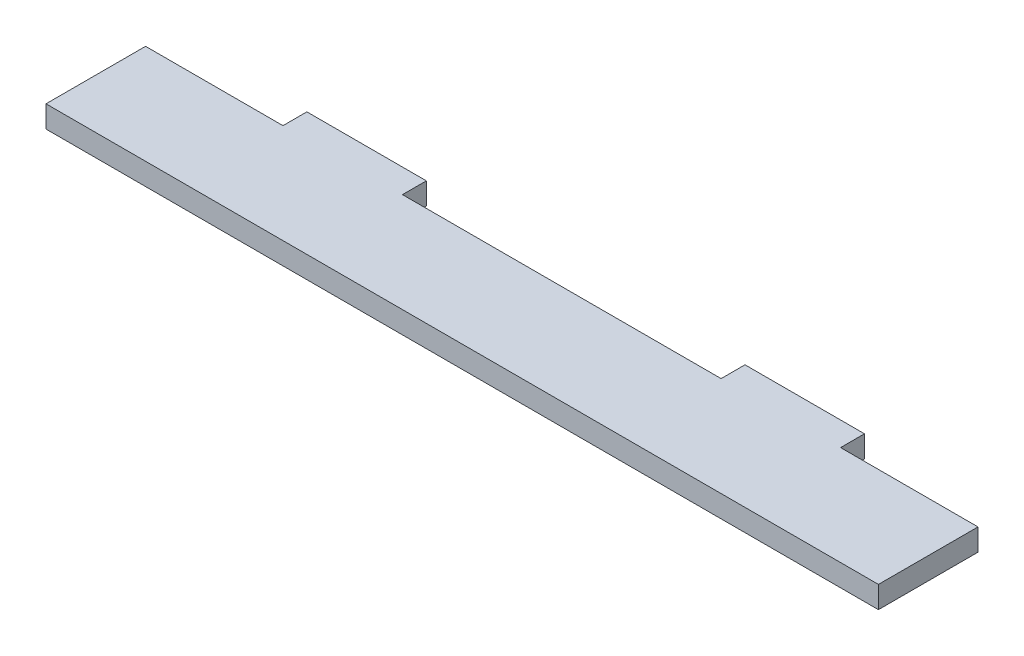
ISO-10303-21;
HEADER;
FILE_DESCRIPTION(('STEP AP214'),'2;1');
FILE_NAME('part.step','',(''),(''),'','','');
FILE_SCHEMA(('AUTOMOTIVE_DESIGN { 1 0 10303 214 1 1 1 1 }'));
ENDSEC;
DATA;
#1=APPLICATION_CONTEXT('core data for automotive mechanical design processes');
#2=APPLICATION_PROTOCOL_DEFINITION('international standard','automotive_design',2000,#1);
#3=PRODUCT_CONTEXT('',#1,'mechanical');
#4=PRODUCT('Part','Part','',(#3));
#5=PRODUCT_RELATED_PRODUCT_CATEGORY('part','',(#4));
#6=PRODUCT_DEFINITION_FORMATION('','',#4);
#7=PRODUCT_DEFINITION_CONTEXT('part definition',#1,'design');
#8=PRODUCT_DEFINITION('design','',#6,#7);
#9=PRODUCT_DEFINITION_SHAPE('','',#8);
#10=(LENGTH_UNIT() NAMED_UNIT(*) SI_UNIT(.MILLI.,.METRE.));
#11=(NAMED_UNIT(*) PLANE_ANGLE_UNIT() SI_UNIT($,.RADIAN.));
#12=(NAMED_UNIT(*) SI_UNIT($,.STERADIAN.) SOLID_ANGLE_UNIT());
#13=UNCERTAINTY_MEASURE_WITH_UNIT(LENGTH_MEASURE(1.E-05),#10,'distance_accuracy_value','');
#14=(GEOMETRIC_REPRESENTATION_CONTEXT(3) GLOBAL_UNCERTAINTY_ASSIGNED_CONTEXT((#13)) GLOBAL_UNIT_ASSIGNED_CONTEXT((#10,
#11,#12)) REPRESENTATION_CONTEXT('',''));
#15=CARTESIAN_POINT('',(0.,0.,0.));
#16=DIRECTION('',(0.,0.,1.));
#17=DIRECTION('',(1.,0.,0.));
#18=AXIS2_PLACEMENT_3D('',#15,#16,#17);
#19=CARTESIAN_POINT('',(-70.,5.5,0.));
#20=DIRECTION('',(-1.,0.,0.));
#21=DIRECTION('',(0.,0.,1.));
#22=AXIS2_PLACEMENT_3D('',#19,#20,#21);
#23=PLANE('',#22);
#24=DIRECTION('',(0.,0.,-1.));
#25=VECTOR('',#24,1.);
#26=CARTESIAN_POINT('',(-70.,0.,0.));
#27=LINE('',#26,#25);
#28=CARTESIAN_POINT('',(-70.,0.,-12.5));
#29=VERTEX_POINT('',#28);
#30=CARTESIAN_POINT('',(-70.,0.,-18.5));
#31=VERTEX_POINT('',#30);
#32=EDGE_CURVE('E202',#29,#31,#27,.T.);
#33=ORIENTED_EDGE('',*,*,#32,.F.);
#34=DIRECTION('',(0.,-1.,0.));
#35=VECTOR('',#34,1.);
#36=CARTESIAN_POINT('',(-70.,5.5,-12.5));
#37=LINE('',#36,#35);
#38=CARTESIAN_POINT('',(-70.,5.5,-12.5));
#39=VERTEX_POINT('',#38);
#40=EDGE_CURVE('E11',#39,#29,#37,.T.);
#41=ORIENTED_EDGE('',*,*,#40,.F.);
#42=DIRECTION('',(0.,0.,-1.));
#43=VECTOR('',#42,1.);
#44=CARTESIAN_POINT('',(-70.,5.5,0.));
#45=LINE('',#44,#43);
#46=CARTESIAN_POINT('',(-70.,5.5,-18.5));
#47=VERTEX_POINT('',#46);
#48=EDGE_CURVE('E163',#39,#47,#45,.T.);
#49=ORIENTED_EDGE('',*,*,#48,.T.);
#50=DIRECTION('',(0.,-1.,0.));
#51=VECTOR('',#50,1.);
#52=CARTESIAN_POINT('',(-70.,5.5,-18.5));
#53=LINE('',#52,#51);
#54=EDGE_CURVE('E55',#47,#31,#53,.T.);
#55=ORIENTED_EDGE('',*,*,#54,.T.);
#56=EDGE_LOOP('',(#33,#41,#49,#55));
#57=FACE_BOUND('',#56,.T.);
#58=ADVANCED_FACE('F39',(#57),#23,.T.);
#59=CARTESIAN_POINT('',(0.,5.5,-12.5));
#60=DIRECTION('',(0.,0.,-1.));
#61=DIRECTION('',(-1.,0.,0.));
#62=AXIS2_PLACEMENT_3D('',#59,#60,#61);
#63=PLANE('',#62);
#64=DIRECTION('',(1.,0.,0.));
#65=VECTOR('',#64,1.);
#66=CARTESIAN_POINT('',(0.,0.,-12.5));
#67=LINE('',#66,#65);
#68=CARTESIAN_POINT('',(-104.5,0.,-12.5));
#69=VERTEX_POINT('',#68);
#70=EDGE_CURVE('E200',#69,#29,#67,.T.);
#71=ORIENTED_EDGE('',*,*,#70,.F.);
#72=DIRECTION('',(0.,-1.,0.));
#73=VECTOR('',#72,1.);
#74=CARTESIAN_POINT('',(-104.5,5.5,-12.5));
#75=LINE('',#74,#73);
#76=CARTESIAN_POINT('',(-104.5,5.5,-12.5));
#77=VERTEX_POINT('',#76);
#78=EDGE_CURVE('E47',#77,#69,#75,.T.);
#79=ORIENTED_EDGE('',*,*,#78,.F.);
#80=DIRECTION('',(1.,0.,0.));
#81=VECTOR('',#80,1.);
#82=CARTESIAN_POINT('',(0.,5.5,-12.5));
#83=LINE('',#82,#81);
#84=EDGE_CURVE('E153',#77,#39,#83,.T.);
#85=ORIENTED_EDGE('',*,*,#84,.T.);
#86=ORIENTED_EDGE('',*,*,#40,.T.);
#87=EDGE_LOOP('',(#71,#79,#85,#86));
#88=FACE_BOUND('',#87,.T.);
#89=ADVANCED_FACE('F201',(#88),#63,.T.);
#90=CARTESIAN_POINT('',(-104.5,5.5,0.));
#91=DIRECTION('',(-1.,0.,0.));
#92=DIRECTION('',(0.,0.,1.));
#93=AXIS2_PLACEMENT_3D('',#90,#91,#92);
#94=PLANE('',#93);
#95=DIRECTION('',(0.,0.,-1.));
#96=VECTOR('',#95,1.);
#97=CARTESIAN_POINT('',(-104.5,0.,0.));
#98=LINE('',#97,#96);
#99=CARTESIAN_POINT('',(-104.5,0.,12.5));
#100=VERTEX_POINT('',#99);
#101=EDGE_CURVE('E197',#100,#69,#98,.T.);
#102=ORIENTED_EDGE('',*,*,#101,.F.);
#103=DIRECTION('',(0.,-1.,0.));
#104=VECTOR('',#103,1.);
#105=CARTESIAN_POINT('',(-104.5,5.5,12.5));
#106=LINE('',#105,#104);
#107=CARTESIAN_POINT('',(-104.5,5.5,12.5));
#108=VERTEX_POINT('',#107);
#109=EDGE_CURVE('E191',#108,#100,#106,.T.);
#110=ORIENTED_EDGE('',*,*,#109,.F.);
#111=DIRECTION('',(0.,0.,-1.));
#112=VECTOR('',#111,1.);
#113=CARTESIAN_POINT('',(-104.5,5.5,0.));
#114=LINE('',#113,#112);
#115=EDGE_CURVE('E162',#108,#77,#114,.T.);
#116=ORIENTED_EDGE('',*,*,#115,.T.);
#117=ORIENTED_EDGE('',*,*,#78,.T.);
#118=EDGE_LOOP('',(#102,#110,#116,#117));
#119=FACE_BOUND('',#118,.T.);
#120=ADVANCED_FACE('F195',(#119),#94,.T.);
#121=CARTESIAN_POINT('',(0.,5.5,12.5));
#122=DIRECTION('',(0.,0.,-1.));
#123=DIRECTION('',(-1.,0.,0.));
#124=AXIS2_PLACEMENT_3D('',#121,#122,#123);
#125=PLANE('',#124);
#126=DIRECTION('',(1.,0.,0.));
#127=VECTOR('',#126,1.);
#128=CARTESIAN_POINT('',(0.,0.,12.5));
#129=LINE('',#128,#127);
#130=CARTESIAN_POINT('',(104.5,0.,12.5));
#131=VERTEX_POINT('',#130);
#132=EDGE_CURVE('E208',#100,#131,#129,.T.);
#133=ORIENTED_EDGE('',*,*,#132,.T.);
#134=DIRECTION('',(0.,-1.,0.));
#135=VECTOR('',#134,1.);
#136=CARTESIAN_POINT('',(104.5,5.5,12.5));
#137=LINE('',#136,#135);
#138=CARTESIAN_POINT('',(104.5,5.5,12.5));
#139=VERTEX_POINT('',#138);
#140=EDGE_CURVE('E188',#139,#131,#137,.T.);
#141=ORIENTED_EDGE('',*,*,#140,.F.);
#142=DIRECTION('',(1.,0.,0.));
#143=VECTOR('',#142,1.);
#144=CARTESIAN_POINT('',(0.,5.5,12.5));
#145=LINE('',#144,#143);
#146=EDGE_CURVE('E167',#108,#139,#145,.T.);
#147=ORIENTED_EDGE('',*,*,#146,.F.);
#148=ORIENTED_EDGE('',*,*,#109,.T.);
#149=EDGE_LOOP('',(#133,#141,#147,#148));
#150=FACE_BOUND('',#149,.T.);
#151=ADVANCED_FACE('F238',(#150),#125,.F.);
#152=CARTESIAN_POINT('',(104.5,5.5,0.));
#153=DIRECTION('',(-1.,0.,0.));
#154=DIRECTION('',(0.,0.,1.));
#155=AXIS2_PLACEMENT_3D('',#152,#153,#154);
#156=PLANE('',#155);
#157=DIRECTION('',(0.,0.,-1.));
#158=VECTOR('',#157,1.);
#159=CARTESIAN_POINT('',(104.5,0.,0.));
#160=LINE('',#159,#158);
#161=CARTESIAN_POINT('',(104.5,0.,-12.5));
#162=VERTEX_POINT('',#161);
#163=EDGE_CURVE('E210',#131,#162,#160,.T.);
#164=ORIENTED_EDGE('',*,*,#163,.T.);
#165=DIRECTION('',(0.,-1.,0.));
#166=VECTOR('',#165,1.);
#167=CARTESIAN_POINT('',(104.5,5.5,-12.5));
#168=LINE('',#167,#166);
#169=CARTESIAN_POINT('',(104.5,5.5,-12.5));
#170=VERTEX_POINT('',#169);
#171=EDGE_CURVE('E186',#170,#162,#168,.T.);
#172=ORIENTED_EDGE('',*,*,#171,.F.);
#173=DIRECTION('',(0.,0.,-1.));
#174=VECTOR('',#173,1.);
#175=CARTESIAN_POINT('',(104.5,5.5,0.));
#176=LINE('',#175,#174);
#177=EDGE_CURVE('E160',#139,#170,#176,.T.);
#178=ORIENTED_EDGE('',*,*,#177,.F.);
#179=ORIENTED_EDGE('',*,*,#140,.T.);
#180=EDGE_LOOP('',(#164,#172,#178,#179));
#181=FACE_BOUND('',#180,.T.);
#182=ADVANCED_FACE('F234',(#181),#156,.F.);
#183=CARTESIAN_POINT('',(70.,0.,-12.5));
#184=VERTEX_POINT('',#183);
#185=EDGE_CURVE('E204',#184,#162,#67,.T.);
#186=ORIENTED_EDGE('',*,*,#185,.F.);
#187=DIRECTION('',(0.,-1.,0.));
#188=VECTOR('',#187,1.);
#189=CARTESIAN_POINT('',(70.,5.5,-12.5));
#190=LINE('',#189,#188);
#191=CARTESIAN_POINT('',(70.,5.5,-12.5));
#192=VERTEX_POINT('',#191);
#193=EDGE_CURVE('E184',#192,#184,#190,.T.);
#194=ORIENTED_EDGE('',*,*,#193,.F.);
#195=EDGE_CURVE('E152',#192,#170,#83,.T.);
#196=ORIENTED_EDGE('',*,*,#195,.T.);
#197=ORIENTED_EDGE('',*,*,#171,.T.);
#198=EDGE_LOOP('',(#186,#194,#196,#197));
#199=FACE_BOUND('',#198,.T.);
#200=ADVANCED_FACE('F228',(#199),#63,.T.);
#201=CARTESIAN_POINT('',(70.,5.5,0.));
#202=DIRECTION('',(-1.,0.,0.));
#203=DIRECTION('',(0.,0.,1.));
#204=AXIS2_PLACEMENT_3D('',#201,#202,#203);
#205=PLANE('',#204);
#206=DIRECTION('',(0.,0.,-1.));
#207=VECTOR('',#206,1.);
#208=CARTESIAN_POINT('',(70.,0.,0.));
#209=LINE('',#208,#207);
#210=CARTESIAN_POINT('',(70.,0.,-18.5));
#211=VERTEX_POINT('',#210);
#212=EDGE_CURVE('E216',#184,#211,#209,.T.);
#213=ORIENTED_EDGE('',*,*,#212,.T.);
#214=DIRECTION('',(0.,-1.,0.));
#215=VECTOR('',#214,1.);
#216=CARTESIAN_POINT('',(70.,5.5,-18.5));
#217=LINE('',#216,#215);
#218=CARTESIAN_POINT('',(70.,5.5,-18.5));
#219=VERTEX_POINT('',#218);
#220=EDGE_CURVE('E181',#219,#211,#217,.T.);
#221=ORIENTED_EDGE('',*,*,#220,.F.);
#222=DIRECTION('',(0.,0.,-1.));
#223=VECTOR('',#222,1.);
#224=CARTESIAN_POINT('',(70.,5.5,0.));
#225=LINE('',#224,#223);
#226=EDGE_CURVE('E159',#192,#219,#225,.T.);
#227=ORIENTED_EDGE('',*,*,#226,.F.);
#228=ORIENTED_EDGE('',*,*,#193,.T.);
#229=EDGE_LOOP('',(#213,#221,#227,#228));
#230=FACE_BOUND('',#229,.T.);
#231=ADVANCED_FACE('F261',(#230),#205,.F.);
#232=CARTESIAN_POINT('',(0.,5.5,-18.5));
#233=DIRECTION('',(0.,0.,1.));
#234=DIRECTION('',(1.,0.,0.));
#235=AXIS2_PLACEMENT_3D('',#232,#233,#234);
#236=PLANE('',#235);
#237=DIRECTION('',(-1.,0.,0.));
#238=VECTOR('',#237,1.);
#239=CARTESIAN_POINT('',(0.,0.,-18.5));
#240=LINE('',#239,#238);
#241=CARTESIAN_POINT('',(40.,0.,-18.5));
#242=VERTEX_POINT('',#241);
#243=EDGE_CURVE('E218',#211,#242,#240,.T.);
#244=ORIENTED_EDGE('',*,*,#243,.T.);
#245=DIRECTION('',(0.,-1.,0.));
#246=VECTOR('',#245,1.);
#247=CARTESIAN_POINT('',(40.,5.5,-18.5));
#248=LINE('',#247,#246);
#249=CARTESIAN_POINT('',(40.,5.5,-18.5));
#250=VERTEX_POINT('',#249);
#251=EDGE_CURVE('E179',#250,#242,#248,.T.);
#252=ORIENTED_EDGE('',*,*,#251,.F.);
#253=DIRECTION('',(-1.,0.,0.));
#254=VECTOR('',#253,1.);
#255=CARTESIAN_POINT('',(0.,5.5,-18.5));
#256=LINE('',#255,#254);
#257=EDGE_CURVE('E154',#219,#250,#256,.T.);
#258=ORIENTED_EDGE('',*,*,#257,.F.);
#259=ORIENTED_EDGE('',*,*,#220,.T.);
#260=EDGE_LOOP('',(#244,#252,#258,#259));
#261=FACE_BOUND('',#260,.T.);
#262=ADVANCED_FACE('F267',(#261),#236,.F.);
#263=CARTESIAN_POINT('',(40.,5.5,0.));
#264=DIRECTION('',(-1.,0.,0.));
#265=DIRECTION('',(0.,0.,1.));
#266=AXIS2_PLACEMENT_3D('',#263,#264,#265);
#267=PLANE('',#266);
#268=DIRECTION('',(0.,0.,-1.));
#269=VECTOR('',#268,1.);
#270=CARTESIAN_POINT('',(40.,0.,0.));
#271=LINE('',#270,#269);
#272=CARTESIAN_POINT('',(40.,0.,-12.5));
#273=VERTEX_POINT('',#272);
#274=EDGE_CURVE('E220',#273,#242,#271,.T.);
#275=ORIENTED_EDGE('',*,*,#274,.F.);
#276=DIRECTION('',(0.,-1.,0.));
#277=VECTOR('',#276,1.);
#278=CARTESIAN_POINT('',(40.,5.5,-12.5));
#279=LINE('',#278,#277);
#280=CARTESIAN_POINT('',(40.,5.5,-12.5));
#281=VERTEX_POINT('',#280);
#282=EDGE_CURVE('E139',#281,#273,#279,.T.);
#283=ORIENTED_EDGE('',*,*,#282,.F.);
#284=DIRECTION('',(0.,0.,-1.));
#285=VECTOR('',#284,1.);
#286=CARTESIAN_POINT('',(40.,5.5,0.));
#287=LINE('',#286,#285);
#288=EDGE_CURVE('E150',#281,#250,#287,.T.);
#289=ORIENTED_EDGE('',*,*,#288,.T.);
#290=ORIENTED_EDGE('',*,*,#251,.T.);
#291=EDGE_LOOP('',(#275,#283,#289,#290));
#292=FACE_BOUND('',#291,.T.);
#293=ADVANCED_FACE('F263',(#292),#267,.T.);
#294=CARTESIAN_POINT('',(-40.,0.,-12.5));
#295=VERTEX_POINT('',#294);
#296=EDGE_CURVE('E136',#295,#273,#67,.T.);
#297=ORIENTED_EDGE('',*,*,#296,.F.);
#298=DIRECTION('',(0.,-1.,0.));
#299=VECTOR('',#298,1.);
#300=CARTESIAN_POINT('',(-40.,5.5,-12.5));
#301=LINE('',#300,#299);
#302=CARTESIAN_POINT('',(-40.,5.5,-12.5));
#303=VERTEX_POINT('',#302);
#304=EDGE_CURVE('E130',#303,#295,#301,.T.);
#305=ORIENTED_EDGE('',*,*,#304,.F.);
#306=EDGE_CURVE('E134',#303,#281,#83,.T.);
#307=ORIENTED_EDGE('',*,*,#306,.T.);
#308=ORIENTED_EDGE('',*,*,#282,.T.);
#309=EDGE_LOOP('',(#297,#305,#307,#308));
#310=FACE_BOUND('',#309,.T.);
#311=ADVANCED_FACE('F132',(#310),#63,.T.);
#312=CARTESIAN_POINT('',(-40.,5.5,0.));
#313=DIRECTION('',(-1.,0.,0.));
#314=DIRECTION('',(0.,0.,1.));
#315=AXIS2_PLACEMENT_3D('',#312,#313,#314);
#316=PLANE('',#315);
#317=DIRECTION('',(0.,0.,-1.));
#318=VECTOR('',#317,1.);
#319=CARTESIAN_POINT('',(-40.,0.,0.));
#320=LINE('',#319,#318);
#321=CARTESIAN_POINT('',(-40.,0.,-18.5));
#322=VERTEX_POINT('',#321);
#323=EDGE_CURVE('E170',#295,#322,#320,.T.);
#324=ORIENTED_EDGE('',*,*,#323,.T.);
#325=DIRECTION('',(0.,-1.,0.));
#326=VECTOR('',#325,1.);
#327=CARTESIAN_POINT('',(-40.,5.5,-18.5));
#328=LINE('',#327,#326);
#329=CARTESIAN_POINT('',(-40.,5.5,-18.5));
#330=VERTEX_POINT('',#329);
#331=EDGE_CURVE('E93',#330,#322,#328,.T.);
#332=ORIENTED_EDGE('',*,*,#331,.F.);
#333=DIRECTION('',(0.,0.,-1.));
#334=VECTOR('',#333,1.);
#335=CARTESIAN_POINT('',(-40.,5.5,0.));
#336=LINE('',#335,#334);
#337=EDGE_CURVE('E141',#303,#330,#336,.T.);
#338=ORIENTED_EDGE('',*,*,#337,.F.);
#339=ORIENTED_EDGE('',*,*,#304,.T.);
#340=EDGE_LOOP('',(#324,#332,#338,#339));
#341=FACE_BOUND('',#340,.T.);
#342=ADVANCED_FACE('F142',(#341),#316,.F.);
#343=CARTESIAN_POINT('',(0.,5.5,-18.5));
#344=DIRECTION('',(0.,0.,-1.));
#345=DIRECTION('',(-1.,0.,0.));
#346=AXIS2_PLACEMENT_3D('',#343,#344,#345);
#347=PLANE('',#346);
#348=DIRECTION('',(1.,0.,0.));
#349=VECTOR('',#348,1.);
#350=CARTESIAN_POINT('',(0.,0.,-18.5));
#351=LINE('',#350,#349);
#352=EDGE_CURVE('E168',#31,#322,#351,.T.);
#353=ORIENTED_EDGE('',*,*,#352,.F.);
#354=ORIENTED_EDGE('',*,*,#54,.F.);
#355=DIRECTION('',(1.,0.,0.));
#356=VECTOR('',#355,1.);
#357=CARTESIAN_POINT('',(0.,5.5,-18.5));
#358=LINE('',#357,#356);
#359=EDGE_CURVE('E145',#47,#330,#358,.T.);
#360=ORIENTED_EDGE('',*,*,#359,.T.);
#361=ORIENTED_EDGE('',*,*,#331,.T.);
#362=EDGE_LOOP('',(#353,#354,#360,#361));
#363=FACE_BOUND('',#362,.T.);
#364=ADVANCED_FACE('F241',(#363),#347,.T.);
#365=CARTESIAN_POINT('',(0.,5.5,0.));
#366=DIRECTION('',(0.,1.,0.));
#367=DIRECTION('',(0.,0.,1.));
#368=AXIS2_PLACEMENT_3D('',#365,#366,#367);
#369=PLANE('',#368);
#370=ORIENTED_EDGE('',*,*,#48,.F.);
#371=ORIENTED_EDGE('',*,*,#84,.F.);
#372=ORIENTED_EDGE('',*,*,#115,.F.);
#373=ORIENTED_EDGE('',*,*,#146,.T.);
#374=ORIENTED_EDGE('',*,*,#177,.T.);
#375=ORIENTED_EDGE('',*,*,#195,.F.);
#376=ORIENTED_EDGE('',*,*,#226,.T.);
#377=ORIENTED_EDGE('',*,*,#257,.T.);
#378=ORIENTED_EDGE('',*,*,#288,.F.);
#379=ORIENTED_EDGE('',*,*,#306,.F.);
#380=ORIENTED_EDGE('',*,*,#337,.T.);
#381=ORIENTED_EDGE('',*,*,#359,.F.);
#382=EDGE_LOOP('',(#370,#371,#372,#373,#374,#375,#376,#377,#378,#379,#380,#381));
#383=FACE_BOUND('',#382,.T.);
#384=ADVANCED_FACE('F148',(#383),#369,.T.);
#385=CARTESIAN_POINT('',(0.,0.,0.));
#386=DIRECTION('',(0.,1.,0.));
#387=DIRECTION('',(0.,0.,1.));
#388=AXIS2_PLACEMENT_3D('',#385,#386,#387);
#389=PLANE('',#388);
#390=ORIENTED_EDGE('',*,*,#32,.T.);
#391=ORIENTED_EDGE('',*,*,#352,.T.);
#392=ORIENTED_EDGE('',*,*,#323,.F.);
#393=ORIENTED_EDGE('',*,*,#296,.T.);
#394=ORIENTED_EDGE('',*,*,#274,.T.);
#395=ORIENTED_EDGE('',*,*,#243,.F.);
#396=ORIENTED_EDGE('',*,*,#212,.F.);
#397=ORIENTED_EDGE('',*,*,#185,.T.);
#398=ORIENTED_EDGE('',*,*,#163,.F.);
#399=ORIENTED_EDGE('',*,*,#132,.F.);
#400=ORIENTED_EDGE('',*,*,#101,.T.);
#401=ORIENTED_EDGE('',*,*,#70,.T.);
#402=EDGE_LOOP('',(#390,#391,#392,#393,#394,#395,#396,#397,#398,#399,#400,#401));
#403=FACE_BOUND('',#402,.T.);
#404=ADVANCED_FACE('F206',(#403),#389,.F.);
#405=CLOSED_SHELL('',(#58,#89,#120,#151,#182,#200,#231,#262,#293,#311,#342,#364,#384,#404));
#406=MANIFOLD_SOLID_BREP('B2',#405);
#407=ADVANCED_BREP_SHAPE_REPRESENTATION('',(#18,#406),#14);
#408=SHAPE_DEFINITION_REPRESENTATION(#9,#407);
ENDSEC;
END-ISO-10303-21;
